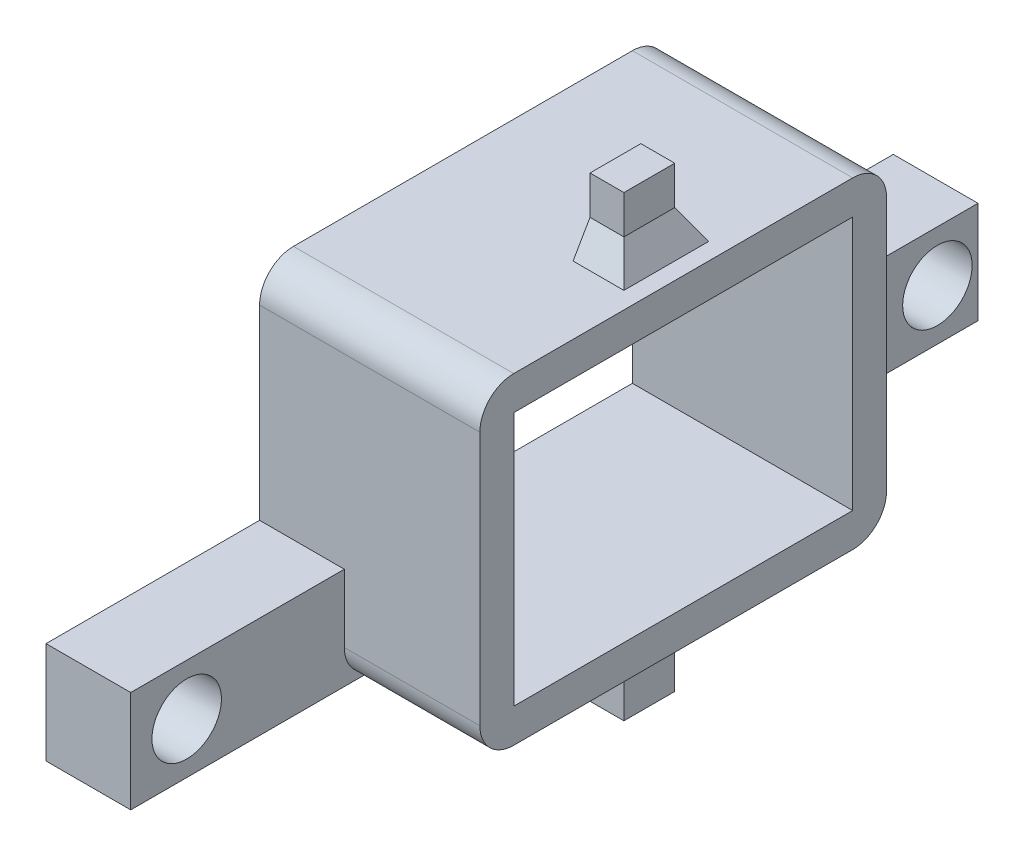
ISO-10303-21;
HEADER;
FILE_DESCRIPTION(('STEP AP214'),'2;1');
FILE_NAME('part.step','',(''),(''),'','','');
FILE_SCHEMA(('AUTOMOTIVE_DESIGN { 1 0 10303 214 1 1 1 1 }'));
ENDSEC;
DATA;
#1=APPLICATION_CONTEXT('core data for automotive mechanical design processes');
#2=APPLICATION_PROTOCOL_DEFINITION('international standard','automotive_design',2000,#1);
#3=PRODUCT_CONTEXT('',#1,'mechanical');
#4=PRODUCT('Part','Part','',(#3));
#5=PRODUCT_RELATED_PRODUCT_CATEGORY('part','',(#4));
#6=PRODUCT_DEFINITION_FORMATION('','',#4);
#7=PRODUCT_DEFINITION_CONTEXT('part definition',#1,'design');
#8=PRODUCT_DEFINITION('design','',#6,#7);
#9=PRODUCT_DEFINITION_SHAPE('','',#8);
#10=(LENGTH_UNIT() NAMED_UNIT(*) SI_UNIT(.MILLI.,.METRE.));
#11=(NAMED_UNIT(*) PLANE_ANGLE_UNIT() SI_UNIT($,.RADIAN.));
#12=(NAMED_UNIT(*) SI_UNIT($,.STERADIAN.) SOLID_ANGLE_UNIT());
#13=UNCERTAINTY_MEASURE_WITH_UNIT(LENGTH_MEASURE(1.E-05),#10,'distance_accuracy_value','');
#14=(GEOMETRIC_REPRESENTATION_CONTEXT(3) GLOBAL_UNCERTAINTY_ASSIGNED_CONTEXT((#13)) GLOBAL_UNIT_ASSIGNED_CONTEXT((#10,
#11,#12)) REPRESENTATION_CONTEXT('',''));
#15=CARTESIAN_POINT('',(0.,0.,0.));
#16=DIRECTION('',(0.,0.,1.));
#17=DIRECTION('',(1.,0.,0.));
#18=AXIS2_PLACEMENT_3D('',#15,#16,#17);
#19=CARTESIAN_POINT('',(13.,-17.,2.));
#20=DIRECTION('',(0.,1.,0.));
#21=DIRECTION('',(0.,0.,1.));
#22=AXIS2_PLACEMENT_3D('',#19,#20,#21);
#23=PLANE('',#22);
#24=DIRECTION('',(0.,0.,1.));
#25=VECTOR('',#24,1.);
#26=CARTESIAN_POINT('',(5.,-17.,-22.));
#27=LINE('',#26,#25);
#28=CARTESIAN_POINT('',(5.,-17.,-35.3962764589194));
#29=VERTEX_POINT('',#28);
#30=CARTESIAN_POINT('',(5.,-17.,-20.));
#31=VERTEX_POINT('',#30);
#32=EDGE_CURVE('E354',#29,#31,#27,.T.);
#33=ORIENTED_EDGE('',*,*,#32,.T.);
#34=DIRECTION('',(-1.,0.,0.));
#35=VECTOR('',#34,1.);
#36=CARTESIAN_POINT('',(13.,-17.,-20.));
#37=LINE('',#36,#35);
#38=CARTESIAN_POINT('',(13.,-17.,-20.));
#39=VERTEX_POINT('',#38);
#40=EDGE_CURVE('E451',#31,#39,#37,.F.);
#41=ORIENTED_EDGE('',*,*,#40,.T.);
#42=DIRECTION('',(0.,0.,-1.));
#43=VECTOR('',#42,1.);
#44=CARTESIAN_POINT('',(13.,-17.,2.));
#45=LINE('',#44,#43);
#46=CARTESIAN_POINT('',(13.,-17.,0.));
#47=VERTEX_POINT('',#46);
#48=EDGE_CURVE('E400',#47,#39,#45,.T.);
#49=ORIENTED_EDGE('',*,*,#48,.F.);
#50=DIRECTION('',(-1.,0.,0.));
#51=VECTOR('',#50,1.);
#52=CARTESIAN_POINT('',(13.,-17.,0.));
#53=LINE('',#52,#51);
#54=CARTESIAN_POINT('',(5.,-17.,0.));
#55=VERTEX_POINT('',#54);
#56=EDGE_CURVE('E448',#47,#55,#53,.T.);
#57=ORIENTED_EDGE('',*,*,#56,.T.);
#58=DIRECTION('',(0.,0.,1.));
#59=VECTOR('',#58,1.);
#60=CARTESIAN_POINT('',(5.,-17.,2.));
#61=LINE('',#60,#59);
#62=CARTESIAN_POINT('',(5.,-17.,14.6037235410806));
#63=VERTEX_POINT('',#62);
#64=EDGE_CURVE('E316',#55,#63,#61,.T.);
#65=ORIENTED_EDGE('',*,*,#64,.T.);
#66=DIRECTION('',(-1.,0.,0.));
#67=VECTOR('',#66,1.);
#68=CARTESIAN_POINT('',(5.,-17.,14.6037235410806));
#69=LINE('',#68,#67);
#70=CARTESIAN_POINT('',(0.,-17.,14.6037235410806));
#71=VERTEX_POINT('',#70);
#72=EDGE_CURVE('E326',#63,#71,#69,.T.);
#73=ORIENTED_EDGE('',*,*,#72,.T.);
#74=DIRECTION('',(0.,0.,-1.));
#75=VECTOR('',#74,1.);
#76=CARTESIAN_POINT('',(0.,-17.,2.));
#77=LINE('',#76,#75);
#78=CARTESIAN_POINT('',(0.,-17.,-35.3962764589194));
#79=VERTEX_POINT('',#78);
#80=EDGE_CURVE('E412',#71,#79,#77,.T.);
#81=ORIENTED_EDGE('',*,*,#80,.T.);
#82=DIRECTION('',(-1.,0.,0.));
#83=VECTOR('',#82,1.);
#84=CARTESIAN_POINT('',(5.,-17.,-35.3962764589194));
#85=LINE('',#84,#83);
#86=EDGE_CURVE('E361',#29,#79,#85,.T.);
#87=ORIENTED_EDGE('',*,*,#86,.F.);
#88=EDGE_LOOP('',(#33,#41,#49,#57,#65,#73,#81,#87));
#89=FACE_BOUND('',#88,.T.);
#90=DIRECTION('',(-1.,0.,0.));
#91=VECTOR('',#90,1.);
#92=CARTESIAN_POINT('',(9.,-17.,-12.5));
#93=LINE('',#92,#91);
#94=CARTESIAN_POINT('',(12.,-17.,-12.5));
#95=VERTEX_POINT('',#94);
#96=CARTESIAN_POINT('',(9.,-17.,-12.5));
#97=VERTEX_POINT('',#96);
#98=EDGE_CURVE('E485',#95,#97,#93,.T.);
#99=ORIENTED_EDGE('',*,*,#98,.T.);
#100=DIRECTION('',(0.,0.,-1.));
#101=VECTOR('',#100,1.);
#102=CARTESIAN_POINT('',(9.,-17.,-8.5));
#103=LINE('',#102,#101);
#104=CARTESIAN_POINT('',(9.,-17.,-7.50000000000001));
#105=VERTEX_POINT('',#104);
#106=EDGE_CURVE('E260',#105,#97,#103,.T.);
#107=ORIENTED_EDGE('',*,*,#106,.F.);
#108=DIRECTION('',(1.,0.,0.));
#109=VECTOR('',#108,1.);
#110=CARTESIAN_POINT('',(11.,-17.,-7.50000000000001));
#111=LINE('',#110,#109);
#112=CARTESIAN_POINT('',(12.,-17.,-7.50000000000001));
#113=VERTEX_POINT('',#112);
#114=EDGE_CURVE('E488',#105,#113,#111,.T.);
#115=ORIENTED_EDGE('',*,*,#114,.T.);
#116=DIRECTION('',(0.,0.,-1.));
#117=VECTOR('',#116,1.);
#118=CARTESIAN_POINT('',(12.,-17.,-11.5));
#119=LINE('',#118,#117);
#120=EDGE_CURVE('E483',#113,#95,#119,.T.);
#121=ORIENTED_EDGE('',*,*,#120,.T.);
#122=EDGE_LOOP('',(#99,#107,#115,#121));
#123=FACE_BOUND('',#122,.T.);
#124=ADVANCED_FACE('F35',(#89,#123),#23,.F.);
#125=CARTESIAN_POINT('',(13.,2.,2.));
#126=DIRECTION('',(0.,-1.,0.));
#127=DIRECTION('',(0.,0.,-1.));
#128=AXIS2_PLACEMENT_3D('',#125,#126,#127);
#129=PLANE('',#128);
#130=DIRECTION('',(0.,0.,1.));
#131=VECTOR('',#130,1.);
#132=CARTESIAN_POINT('',(13.,2.,2.));
#133=LINE('',#132,#131);
#134=CARTESIAN_POINT('',(13.,2.,-20.));
#135=VERTEX_POINT('',#134);
#136=CARTESIAN_POINT('',(13.,2.,0.));
#137=VERTEX_POINT('',#136);
#138=EDGE_CURVE('E407',#135,#137,#133,.T.);
#139=ORIENTED_EDGE('',*,*,#138,.F.);
#140=DIRECTION('',(-1.,0.,0.));
#141=VECTOR('',#140,1.);
#142=CARTESIAN_POINT('',(13.,2.,-20.));
#143=LINE('',#142,#141);
#144=CARTESIAN_POINT('',(0.,2.,-20.));
#145=VERTEX_POINT('',#144);
#146=EDGE_CURVE('E468',#135,#145,#143,.T.);
#147=ORIENTED_EDGE('',*,*,#146,.T.);
#148=DIRECTION('',(0.,0.,1.));
#149=VECTOR('',#148,1.);
#150=CARTESIAN_POINT('',(0.,2.,2.));
#151=LINE('',#150,#149);
#152=CARTESIAN_POINT('',(0.,2.,0.));
#153=VERTEX_POINT('',#152);
#154=EDGE_CURVE('E401',#145,#153,#151,.T.);
#155=ORIENTED_EDGE('',*,*,#154,.T.);
#156=DIRECTION('',(-1.,0.,0.));
#157=VECTOR('',#156,1.);
#158=CARTESIAN_POINT('',(13.,2.,0.));
#159=LINE('',#158,#157);
#160=EDGE_CURVE('E466',#153,#137,#159,.F.);
#161=ORIENTED_EDGE('',*,*,#160,.T.);
#162=EDGE_LOOP('',(#139,#147,#155,#161));
#163=FACE_BOUND('',#162,.T.);
#164=DIRECTION('',(-1.,0.,0.));
#165=VECTOR('',#164,1.);
#166=CARTESIAN_POINT('',(9.,2.,-7.50000000000001));
#167=LINE('',#166,#165);
#168=CARTESIAN_POINT('',(12.,2.,-7.50000000000001));
#169=VERTEX_POINT('',#168);
#170=CARTESIAN_POINT('',(9.,2.,-7.50000000000001));
#171=VERTEX_POINT('',#170);
#172=EDGE_CURVE('E423',#169,#171,#167,.T.);
#173=ORIENTED_EDGE('',*,*,#172,.T.);
#174=DIRECTION('',(0.,0.,1.));
#175=VECTOR('',#174,1.);
#176=CARTESIAN_POINT('',(9.,2.,-11.5));
#177=LINE('',#176,#175);
#178=CARTESIAN_POINT('',(9.,2.,-12.5));
#179=VERTEX_POINT('',#178);
#180=EDGE_CURVE('E263',#179,#171,#177,.T.);
#181=ORIENTED_EDGE('',*,*,#180,.F.);
#182=DIRECTION('',(1.,0.,0.));
#183=VECTOR('',#182,1.);
#184=CARTESIAN_POINT('',(11.,2.,-12.5));
#185=LINE('',#184,#183);
#186=CARTESIAN_POINT('',(12.,2.,-12.5));
#187=VERTEX_POINT('',#186);
#188=EDGE_CURVE('E426',#179,#187,#185,.T.);
#189=ORIENTED_EDGE('',*,*,#188,.T.);
#190=DIRECTION('',(0.,0.,1.));
#191=VECTOR('',#190,1.);
#192=CARTESIAN_POINT('',(12.,2.,-8.5));
#193=LINE('',#192,#191);
#194=EDGE_CURVE('E421',#187,#169,#193,.T.);
#195=ORIENTED_EDGE('',*,*,#194,.T.);
#196=EDGE_LOOP('',(#173,#181,#189,#195));
#197=FACE_BOUND('',#196,.T.);
#198=ADVANCED_FACE('F530',(#163,#197),#129,.F.);
#199=CARTESIAN_POINT('',(13.,0.,0.));
#200=DIRECTION('',(0.,0.,-1.));
#201=DIRECTION('',(0.,1.,0.));
#202=AXIS2_PLACEMENT_3D('',#199,#200,#201);
#203=PLANE('',#202);
#204=DIRECTION('',(-1.,0.,0.));
#205=VECTOR('',#204,1.);
#206=CARTESIAN_POINT('',(0.,-2.,0.));
#207=LINE('',#206,#205);
#208=CARTESIAN_POINT('',(3.,-2.,0.));
#209=VERTEX_POINT('',#208);
#210=CARTESIAN_POINT('',(0.,-2.,0.));
#211=VERTEX_POINT('',#210);
#212=EDGE_CURVE('E298',#209,#211,#207,.T.);
#213=ORIENTED_EDGE('',*,*,#212,.F.);
#214=DIRECTION('',(0.,1.,0.));
#215=VECTOR('',#214,1.);
#216=CARTESIAN_POINT('',(3.,-2.,0.));
#217=LINE('',#216,#215);
#218=CARTESIAN_POINT('',(3.,0.,0.));
#219=VERTEX_POINT('',#218);
#220=EDGE_CURVE('E300',#209,#219,#217,.T.);
#221=ORIENTED_EDGE('',*,*,#220,.T.);
#222=DIRECTION('',(-1.,0.,0.));
#223=VECTOR('',#222,1.);
#224=CARTESIAN_POINT('',(13.,0.,0.));
#225=LINE('',#224,#223);
#226=CARTESIAN_POINT('',(13.,0.,0.));
#227=VERTEX_POINT('',#226);
#228=EDGE_CURVE('E379',#227,#219,#225,.T.);
#229=ORIENTED_EDGE('',*,*,#228,.F.);
#230=DIRECTION('',(0.,-1.,0.));
#231=VECTOR('',#230,1.);
#232=CARTESIAN_POINT('',(13.,0.,0.));
#233=LINE('',#232,#231);
#234=CARTESIAN_POINT('',(13.,-15.,0.));
#235=VERTEX_POINT('',#234);
#236=EDGE_CURVE('E369',#227,#235,#233,.T.);
#237=ORIENTED_EDGE('',*,*,#236,.T.);
#238=DIRECTION('',(-1.,0.,0.));
#239=VECTOR('',#238,1.);
#240=CARTESIAN_POINT('',(13.,-15.,0.));
#241=LINE('',#240,#239);
#242=CARTESIAN_POINT('',(0.,-15.,0.));
#243=VERTEX_POINT('',#242);
#244=EDGE_CURVE('E393',#235,#243,#241,.T.);
#245=ORIENTED_EDGE('',*,*,#244,.T.);
#246=DIRECTION('',(0.,-1.,0.));
#247=VECTOR('',#246,1.);
#248=CARTESIAN_POINT('',(0.,0.,0.));
#249=LINE('',#248,#247);
#250=EDGE_CURVE('E364',#211,#243,#249,.T.);
#251=ORIENTED_EDGE('',*,*,#250,.F.);
#252=EDGE_LOOP('',(#213,#221,#229,#237,#245,#251));
#253=FACE_BOUND('',#252,.T.);
#254=ADVANCED_FACE('F536',(#253),#203,.T.);
#255=CARTESIAN_POINT('',(13.,0.,-20.));
#256=DIRECTION('',(0.,0.,1.));
#257=DIRECTION('',(0.,-1.,0.));
#258=AXIS2_PLACEMENT_3D('',#255,#256,#257);
#259=PLANE('',#258);
#260=DIRECTION('',(-1.,0.,0.));
#261=VECTOR('',#260,1.);
#262=CARTESIAN_POINT('',(13.,0.,-20.));
#263=LINE('',#262,#261);
#264=CARTESIAN_POINT('',(13.,0.,-20.));
#265=VERTEX_POINT('',#264);
#266=CARTESIAN_POINT('',(3.00000000000001,0.,-20.));
#267=VERTEX_POINT('',#266);
#268=EDGE_CURVE('E388',#265,#267,#263,.T.);
#269=ORIENTED_EDGE('',*,*,#268,.T.);
#270=DIRECTION('',(0.,1.,0.));
#271=VECTOR('',#270,1.);
#272=CARTESIAN_POINT('',(3.,-2.,-20.));
#273=LINE('',#272,#271);
#274=CARTESIAN_POINT('',(3.,-2.,-20.));
#275=VERTEX_POINT('',#274);
#276=EDGE_CURVE('E304',#275,#267,#273,.T.);
#277=ORIENTED_EDGE('',*,*,#276,.F.);
#278=DIRECTION('',(1.,0.,0.));
#279=VECTOR('',#278,1.);
#280=CARTESIAN_POINT('',(0.,-2.,-20.));
#281=LINE('',#280,#279);
#282=CARTESIAN_POINT('',(0.,-2.,-20.));
#283=VERTEX_POINT('',#282);
#284=EDGE_CURVE('E294',#283,#275,#281,.T.);
#285=ORIENTED_EDGE('',*,*,#284,.F.);
#286=DIRECTION('',(0.,1.,0.));
#287=VECTOR('',#286,1.);
#288=CARTESIAN_POINT('',(0.,0.,-20.));
#289=LINE('',#288,#287);
#290=CARTESIAN_POINT('',(0.,-15.,-20.));
#291=VERTEX_POINT('',#290);
#292=EDGE_CURVE('E372',#291,#283,#289,.T.);
#293=ORIENTED_EDGE('',*,*,#292,.F.);
#294=DIRECTION('',(-1.,0.,0.));
#295=VECTOR('',#294,1.);
#296=CARTESIAN_POINT('',(13.,-15.,-20.));
#297=LINE('',#296,#295);
#298=CARTESIAN_POINT('',(13.,-15.,-20.));
#299=VERTEX_POINT('',#298);
#300=EDGE_CURVE('E391',#299,#291,#297,.T.);
#301=ORIENTED_EDGE('',*,*,#300,.F.);
#302=DIRECTION('',(0.,1.,0.));
#303=VECTOR('',#302,1.);
#304=CARTESIAN_POINT('',(13.,0.,-20.));
#305=LINE('',#304,#303);
#306=EDGE_CURVE('E374',#299,#265,#305,.T.);
#307=ORIENTED_EDGE('',*,*,#306,.T.);
#308=EDGE_LOOP('',(#269,#277,#285,#293,#301,#307));
#309=FACE_BOUND('',#308,.T.);
#310=ADVANCED_FACE('F762',(#309),#259,.T.);
#311=CARTESIAN_POINT('',(13.,0.,0.));
#312=DIRECTION('',(0.,-1.,0.));
#313=DIRECTION('',(0.,0.,-1.));
#314=AXIS2_PLACEMENT_3D('',#311,#312,#313);
#315=PLANE('',#314);
#316=ORIENTED_EDGE('',*,*,#228,.T.);
#317=DIRECTION('',(0.,0.,1.));
#318=VECTOR('',#317,1.);
#319=CARTESIAN_POINT('',(3.,0.,0.));
#320=LINE('',#319,#318);
#321=EDGE_CURVE('E291',#267,#219,#320,.T.);
#322=ORIENTED_EDGE('',*,*,#321,.F.);
#323=ORIENTED_EDGE('',*,*,#268,.F.);
#324=DIRECTION('',(0.,0.,1.));
#325=VECTOR('',#324,1.);
#326=CARTESIAN_POINT('',(13.,0.,0.));
#327=LINE('',#326,#325);
#328=EDGE_CURVE('E377',#265,#227,#327,.T.);
#329=ORIENTED_EDGE('',*,*,#328,.T.);
#330=EDGE_LOOP('',(#316,#322,#323,#329));
#331=FACE_BOUND('',#330,.T.);
#332=ADVANCED_FACE('F546',(#331),#315,.T.);
#333=CARTESIAN_POINT('',(13.,2.,2.));
#334=DIRECTION('',(0.,0.,-1.));
#335=DIRECTION('',(0.,1.,0.));
#336=AXIS2_PLACEMENT_3D('',#333,#334,#335);
#337=PLANE('',#336);
#338=DIRECTION('',(0.,-1.,0.));
#339=VECTOR('',#338,1.);
#340=CARTESIAN_POINT('',(5.,-17.,2.));
#341=LINE('',#340,#339);
#342=CARTESIAN_POINT('',(5.,-11.,2.));
#343=VERTEX_POINT('',#342);
#344=CARTESIAN_POINT('',(5.,-15.,2.));
#345=VERTEX_POINT('',#344);
#346=EDGE_CURVE('E313',#343,#345,#341,.T.);
#347=ORIENTED_EDGE('',*,*,#346,.T.);
#348=DIRECTION('',(-1.,0.,0.));
#349=VECTOR('',#348,1.);
#350=CARTESIAN_POINT('',(13.,-15.,2.));
#351=LINE('',#350,#349);
#352=CARTESIAN_POINT('',(13.,-15.,2.));
#353=VERTEX_POINT('',#352);
#354=EDGE_CURVE('E464',#345,#353,#351,.F.);
#355=ORIENTED_EDGE('',*,*,#354,.T.);
#356=DIRECTION('',(0.,-1.,0.));
#357=VECTOR('',#356,1.);
#358=CARTESIAN_POINT('',(13.,2.,2.));
#359=LINE('',#358,#357);
#360=CARTESIAN_POINT('',(13.,0.,2.));
#361=VERTEX_POINT('',#360);
#362=EDGE_CURVE('E397',#361,#353,#359,.T.);
#363=ORIENTED_EDGE('',*,*,#362,.F.);
#364=DIRECTION('',(-1.,0.,0.));
#365=VECTOR('',#364,1.);
#366=CARTESIAN_POINT('',(13.,0.,2.));
#367=LINE('',#366,#365);
#368=CARTESIAN_POINT('',(0.,0.,2.));
#369=VERTEX_POINT('',#368);
#370=EDGE_CURVE('E461',#361,#369,#367,.T.);
#371=ORIENTED_EDGE('',*,*,#370,.T.);
#372=DIRECTION('',(0.,-1.,0.));
#373=VECTOR('',#372,1.);
#374=CARTESIAN_POINT('',(0.,2.,2.));
#375=LINE('',#374,#373);
#376=CARTESIAN_POINT('',(0.,-11.,2.));
#377=VERTEX_POINT('',#376);
#378=EDGE_CURVE('E396',#369,#377,#375,.T.);
#379=ORIENTED_EDGE('',*,*,#378,.T.);
#380=DIRECTION('',(-1.,0.,0.));
#381=VECTOR('',#380,1.);
#382=CARTESIAN_POINT('',(5.,-11.,2.));
#383=LINE('',#382,#381);
#384=EDGE_CURVE('E331',#343,#377,#383,.T.);
#385=ORIENTED_EDGE('',*,*,#384,.F.);
#386=EDGE_LOOP('',(#347,#355,#363,#371,#379,#385));
#387=FACE_BOUND('',#386,.T.);
#388=ADVANCED_FACE('F542',(#387),#337,.F.);
#389=CARTESIAN_POINT('',(13.,0.,0.));
#390=DIRECTION('',(1.,0.,0.));
#391=DIRECTION('',(0.,0.,-1.));
#392=AXIS2_PLACEMENT_3D('',#389,#390,#391);
#393=PLANE('',#392);
#394=ORIENTED_EDGE('',*,*,#48,.T.);
#395=CARTESIAN_POINT('',(13.,-15.,-20.));
#396=DIRECTION('',(1.,0.,0.));
#397=DIRECTION('',(0.,0.,-1.));
#398=AXIS2_PLACEMENT_3D('',#395,#396,#397);
#399=CIRCLE('',#398,2.);
#400=CARTESIAN_POINT('',(13.,-15.,-22.));
#401=VERTEX_POINT('',#400);
#402=EDGE_CURVE('E459',#39,#401,#399,.T.);
#403=ORIENTED_EDGE('',*,*,#402,.T.);
#404=DIRECTION('',(0.,1.,0.));
#405=VECTOR('',#404,1.);
#406=CARTESIAN_POINT('',(13.,2.,-22.));
#407=LINE('',#406,#405);
#408=CARTESIAN_POINT('',(13.,0.,-22.));
#409=VERTEX_POINT('',#408);
#410=EDGE_CURVE('E404',#401,#409,#407,.T.);
#411=ORIENTED_EDGE('',*,*,#410,.T.);
#412=CARTESIAN_POINT('',(13.,0.,-20.));
#413=DIRECTION('',(1.,0.,0.));
#414=DIRECTION('',(0.,0.,-1.));
#415=AXIS2_PLACEMENT_3D('',#412,#413,#414);
#416=CIRCLE('',#415,2.);
#417=EDGE_CURVE('E455',#409,#135,#416,.T.);
#418=ORIENTED_EDGE('',*,*,#417,.T.);
#419=ORIENTED_EDGE('',*,*,#138,.T.);
#420=CARTESIAN_POINT('',(13.,0.,0.));
#421=DIRECTION('',(1.,0.,0.));
#422=DIRECTION('',(0.,0.,-1.));
#423=AXIS2_PLACEMENT_3D('',#420,#421,#422);
#424=CIRCLE('',#423,2.);
#425=EDGE_CURVE('E453',#137,#361,#424,.T.);
#426=ORIENTED_EDGE('',*,*,#425,.T.);
#427=ORIENTED_EDGE('',*,*,#362,.T.);
#428=CARTESIAN_POINT('',(13.,-15.,0.));
#429=DIRECTION('',(1.,0.,0.));
#430=DIRECTION('',(0.,0.,-1.));
#431=AXIS2_PLACEMENT_3D('',#428,#429,#430);
#432=CIRCLE('',#431,2.);
#433=EDGE_CURVE('E457',#353,#47,#432,.T.);
#434=ORIENTED_EDGE('',*,*,#433,.T.);
#435=EDGE_LOOP('',(#394,#403,#411,#418,#419,#426,#427,#434));
#436=FACE_BOUND('',#435,.T.);
#437=DIRECTION('',(0.,0.,-1.));
#438=VECTOR('',#437,1.);
#439=CARTESIAN_POINT('',(13.,-15.,0.));
#440=LINE('',#439,#438);
#441=EDGE_CURVE('E371',#235,#299,#440,.T.);
#442=ORIENTED_EDGE('',*,*,#441,.F.);
#443=ORIENTED_EDGE('',*,*,#236,.F.);
#444=ORIENTED_EDGE('',*,*,#328,.F.);
#445=ORIENTED_EDGE('',*,*,#306,.F.);
#446=EDGE_LOOP('',(#442,#443,#444,#445));
#447=FACE_BOUND('',#446,.T.);
#448=ADVANCED_FACE('F545',(#436,#447),#393,.T.);
#449=CARTESIAN_POINT('',(0.,0.,0.));
#450=DIRECTION('',(1.,0.,0.));
#451=DIRECTION('',(0.,0.,-1.));
#452=AXIS2_PLACEMENT_3D('',#449,#450,#451);
#453=PLANE('',#452);
#454=DIRECTION('',(0.,0.,-1.));
#455=VECTOR('',#454,1.);
#456=CARTESIAN_POINT('',(0.,-2.,0.));
#457=LINE('',#456,#455);
#458=EDGE_CURVE('E292',#211,#283,#457,.T.);
#459=ORIENTED_EDGE('',*,*,#458,.F.);
#460=ORIENTED_EDGE('',*,*,#250,.T.);
#461=DIRECTION('',(0.,0.,-1.));
#462=VECTOR('',#461,1.);
#463=CARTESIAN_POINT('',(0.,-15.,0.));
#464=LINE('',#463,#462);
#465=EDGE_CURVE('E381',#243,#291,#464,.T.);
#466=ORIENTED_EDGE('',*,*,#465,.T.);
#467=ORIENTED_EDGE('',*,*,#292,.T.);
#468=EDGE_LOOP('',(#459,#460,#466,#467));
#469=FACE_BOUND('',#468,.T.);
#470=ORIENTED_EDGE('',*,*,#154,.F.);
#471=CARTESIAN_POINT('',(0.,0.,-20.));
#472=DIRECTION('',(1.,0.,0.));
#473=DIRECTION('',(0.,0.,-1.));
#474=AXIS2_PLACEMENT_3D('',#471,#472,#473);
#475=CIRCLE('',#474,2.);
#476=CARTESIAN_POINT('',(0.,0.,-22.));
#477=VERTEX_POINT('',#476);
#478=EDGE_CURVE('E473',#145,#477,#475,.F.);
#479=ORIENTED_EDGE('',*,*,#478,.T.);
#480=DIRECTION('',(0.,1.,0.));
#481=VECTOR('',#480,1.);
#482=CARTESIAN_POINT('',(0.,2.,-22.));
#483=LINE('',#482,#481);
#484=CARTESIAN_POINT('',(0.,-10.9964603513504,-22.));
#485=VERTEX_POINT('',#484);
#486=EDGE_CURVE('E414',#485,#477,#483,.T.);
#487=ORIENTED_EDGE('',*,*,#486,.F.);
#488=DIRECTION('',(0.,0.,-1.));
#489=VECTOR('',#488,1.);
#490=CARTESIAN_POINT('',(0.,-10.9964603513504,-22.));
#491=LINE('',#490,#489);
#492=CARTESIAN_POINT('',(0.,-10.9964603513504,-35.3962764589194));
#493=VERTEX_POINT('',#492);
#494=EDGE_CURVE('E342',#485,#493,#491,.T.);
#495=ORIENTED_EDGE('',*,*,#494,.T.);
#496=DIRECTION('',(0.,-1.,0.));
#497=VECTOR('',#496,1.);
#498=CARTESIAN_POINT('',(0.,-17.,-35.3962764589194));
#499=LINE('',#498,#497);
#500=EDGE_CURVE('E348',#493,#79,#499,.T.);
#501=ORIENTED_EDGE('',*,*,#500,.T.);
#502=ORIENTED_EDGE('',*,*,#80,.F.);
#503=DIRECTION('',(0.,1.,0.));
#504=VECTOR('',#503,1.);
#505=CARTESIAN_POINT('',(0.,-17.,14.6037235410806));
#506=LINE('',#505,#504);
#507=CARTESIAN_POINT('',(0.,-11.,14.6037235410806));
#508=VERTEX_POINT('',#507);
#509=EDGE_CURVE('E310',#71,#508,#506,.T.);
#510=ORIENTED_EDGE('',*,*,#509,.T.);
#511=DIRECTION('',(0.,0.,-1.));
#512=VECTOR('',#511,1.);
#513=CARTESIAN_POINT('',(0.,-11.,2.));
#514=LINE('',#513,#512);
#515=EDGE_CURVE('E317',#508,#377,#514,.T.);
#516=ORIENTED_EDGE('',*,*,#515,.T.);
#517=ORIENTED_EDGE('',*,*,#378,.F.);
#518=CARTESIAN_POINT('',(0.,0.,0.));
#519=DIRECTION('',(1.,0.,0.));
#520=DIRECTION('',(0.,0.,-1.));
#521=AXIS2_PLACEMENT_3D('',#518,#519,#520);
#522=CIRCLE('',#521,2.);
#523=EDGE_CURVE('E471',#369,#153,#522,.F.);
#524=ORIENTED_EDGE('',*,*,#523,.T.);
#525=EDGE_LOOP('',(#470,#479,#487,#495,#501,#502,#510,#516,#517,#524));
#526=FACE_BOUND('',#525,.T.);
#527=CARTESIAN_POINT('',(0.,-13.9982301756752,-33.));
#528=DIRECTION('',(-1.,0.,0.));
#529=DIRECTION('',(0.,0.,1.));
#530=AXIS2_PLACEMENT_3D('',#527,#528,#529);
#531=CIRCLE('',#530,2.05);
#532=CARTESIAN_POINT('',(0.,-13.9982301756752,-30.95));
#533=VERTEX_POINT('',#532);
#534=EDGE_CURVE('E334',#533,#533,#531,.T.);
#535=ORIENTED_EDGE('',*,*,#534,.F.);
#536=EDGE_LOOP('',(#535));
#537=FACE_BOUND('',#536,.T.);
#538=CARTESIAN_POINT('',(0.,-14.,11.299999964647));
#539=DIRECTION('',(-1.,0.,0.));
#540=DIRECTION('',(0.,0.,1.));
#541=AXIS2_PLACEMENT_3D('',#538,#539,#540);
#542=CIRCLE('',#541,2.05);
#543=CARTESIAN_POINT('',(0.,-14.,13.349999964647));
#544=VERTEX_POINT('',#543);
#545=EDGE_CURVE('E306',#544,#544,#542,.T.);
#546=ORIENTED_EDGE('',*,*,#545,.F.);
#547=EDGE_LOOP('',(#546));
#548=FACE_BOUND('',#547,.T.);
#549=ADVANCED_FACE('F741',(#469,#526,#537,#548),#453,.F.);
#550=CARTESIAN_POINT('',(13.,2.,-22.));
#551=DIRECTION('',(0.,0.,1.));
#552=DIRECTION('',(0.,-1.,0.));
#553=AXIS2_PLACEMENT_3D('',#550,#551,#552);
#554=PLANE('',#553);
#555=ORIENTED_EDGE('',*,*,#410,.F.);
#556=DIRECTION('',(-1.,0.,0.));
#557=VECTOR('',#556,1.);
#558=CARTESIAN_POINT('',(13.,-15.,-22.));
#559=LINE('',#558,#557);
#560=CARTESIAN_POINT('',(5.,-15.,-22.));
#561=VERTEX_POINT('',#560);
#562=EDGE_CURVE('E445',#401,#561,#559,.T.);
#563=ORIENTED_EDGE('',*,*,#562,.T.);
#564=DIRECTION('',(0.,1.,0.));
#565=VECTOR('',#564,1.);
#566=CARTESIAN_POINT('',(5.,-17.,-22.));
#567=LINE('',#566,#565);
#568=CARTESIAN_POINT('',(5.,-10.9964603513504,-22.));
#569=VERTEX_POINT('',#568);
#570=EDGE_CURVE('E345',#561,#569,#567,.T.);
#571=ORIENTED_EDGE('',*,*,#570,.T.);
#572=DIRECTION('',(-1.,0.,0.));
#573=VECTOR('',#572,1.);
#574=CARTESIAN_POINT('',(5.,-10.9964603513504,-22.));
#575=LINE('',#574,#573);
#576=EDGE_CURVE('E356',#569,#485,#575,.T.);
#577=ORIENTED_EDGE('',*,*,#576,.T.);
#578=ORIENTED_EDGE('',*,*,#486,.T.);
#579=DIRECTION('',(-1.,0.,0.));
#580=VECTOR('',#579,1.);
#581=CARTESIAN_POINT('',(13.,0.,-22.));
#582=LINE('',#581,#580);
#583=EDGE_CURVE('E437',#477,#409,#582,.F.);
#584=ORIENTED_EDGE('',*,*,#583,.T.);
#585=EDGE_LOOP('',(#555,#563,#571,#577,#578,#584));
#586=FACE_BOUND('',#585,.T.);
#587=ADVANCED_FACE('F541',(#586),#554,.F.);
#588=CARTESIAN_POINT('',(13.,-15.,0.));
#589=DIRECTION('',(0.,1.,0.));
#590=DIRECTION('',(0.,0.,1.));
#591=AXIS2_PLACEMENT_3D('',#588,#589,#590);
#592=PLANE('',#591);
#593=ORIENTED_EDGE('',*,*,#465,.F.);
#594=ORIENTED_EDGE('',*,*,#244,.F.);
#595=ORIENTED_EDGE('',*,*,#441,.T.);
#596=ORIENTED_EDGE('',*,*,#300,.T.);
#597=EDGE_LOOP('',(#593,#594,#595,#596));
#598=FACE_BOUND('',#597,.T.);
#599=ADVANCED_FACE('F846',(#598),#592,.T.);
#600=CARTESIAN_POINT('',(5.,-17.,-35.3962764589194));
#601=DIRECTION('',(0.,0.,-1.));
#602=DIRECTION('',(-1.,0.,0.));
#603=AXIS2_PLACEMENT_3D('',#600,#601,#602);
#604=PLANE('',#603);
#605=ORIENTED_EDGE('',*,*,#500,.F.);
#606=DIRECTION('',(-1.,0.,0.));
#607=VECTOR('',#606,1.);
#608=CARTESIAN_POINT('',(5.,-10.9964603513504,-35.3962764589194));
#609=LINE('',#608,#607);
#610=CARTESIAN_POINT('',(5.,-10.9964603513504,-35.3962764589194));
#611=VERTEX_POINT('',#610);
#612=EDGE_CURVE('E365',#611,#493,#609,.T.);
#613=ORIENTED_EDGE('',*,*,#612,.F.);
#614=DIRECTION('',(0.,-1.,0.));
#615=VECTOR('',#614,1.);
#616=CARTESIAN_POINT('',(5.,-17.,-35.3962764589194));
#617=LINE('',#616,#615);
#618=EDGE_CURVE('E351',#611,#29,#617,.T.);
#619=ORIENTED_EDGE('',*,*,#618,.T.);
#620=ORIENTED_EDGE('',*,*,#86,.T.);
#621=EDGE_LOOP('',(#605,#613,#619,#620));
#622=FACE_BOUND('',#621,.T.);
#623=ADVANCED_FACE('F838',(#622),#604,.T.);
#624=CARTESIAN_POINT('',(5.,-10.9964603513504,-22.));
#625=DIRECTION('',(0.,1.,0.));
#626=DIRECTION('',(0.,0.,1.));
#627=AXIS2_PLACEMENT_3D('',#624,#625,#626);
#628=PLANE('',#627);
#629=ORIENTED_EDGE('',*,*,#494,.F.);
#630=ORIENTED_EDGE('',*,*,#576,.F.);
#631=DIRECTION('',(0.,0.,-1.));
#632=VECTOR('',#631,1.);
#633=CARTESIAN_POINT('',(5.,-10.9964603513504,-22.));
#634=LINE('',#633,#632);
#635=EDGE_CURVE('E347',#569,#611,#634,.T.);
#636=ORIENTED_EDGE('',*,*,#635,.T.);
#637=ORIENTED_EDGE('',*,*,#612,.T.);
#638=EDGE_LOOP('',(#629,#630,#636,#637));
#639=FACE_BOUND('',#638,.T.);
#640=ADVANCED_FACE('F831',(#639),#628,.T.);
#641=CARTESIAN_POINT('',(5.,0.,0.));
#642=DIRECTION('',(-1.,0.,0.));
#643=DIRECTION('',(0.,0.,1.));
#644=AXIS2_PLACEMENT_3D('',#641,#642,#643);
#645=PLANE('',#644);
#646=CARTESIAN_POINT('',(5.,-13.9982301756752,-33.));
#647=DIRECTION('',(-1.,0.,0.));
#648=DIRECTION('',(0.,0.,1.));
#649=AXIS2_PLACEMENT_3D('',#646,#647,#648);
#650=CIRCLE('',#649,2.05);
#651=CARTESIAN_POINT('',(5.,-13.9982301756752,-30.95));
#652=VERTEX_POINT('',#651);
#653=EDGE_CURVE('E339',#652,#652,#650,.T.);
#654=ORIENTED_EDGE('',*,*,#653,.T.);
#655=EDGE_LOOP('',(#654));
#656=FACE_BOUND('',#655,.T.);
#657=ORIENTED_EDGE('',*,*,#570,.F.);
#658=CARTESIAN_POINT('',(5.,-15.,-20.));
#659=DIRECTION('',(-1.,0.,0.));
#660=DIRECTION('',(0.,0.,1.));
#661=AXIS2_PLACEMENT_3D('',#658,#659,#660);
#662=CIRCLE('',#661,2.);
#663=EDGE_CURVE('E475',#561,#31,#662,.T.);
#664=ORIENTED_EDGE('',*,*,#663,.T.);
#665=ORIENTED_EDGE('',*,*,#32,.F.);
#666=ORIENTED_EDGE('',*,*,#618,.F.);
#667=ORIENTED_EDGE('',*,*,#635,.F.);
#668=EDGE_LOOP('',(#657,#664,#665,#666,#667));
#669=FACE_BOUND('',#668,.T.);
#670=ADVANCED_FACE('F822',(#656,#669),#645,.F.);
#671=CARTESIAN_POINT('',(5.,-13.9982301756752,-33.));
#672=DIRECTION('',(-1.,0.,0.));
#673=DIRECTION('',(0.,0.,1.));
#674=AXIS2_PLACEMENT_3D('',#671,#672,#673);
#675=CYLINDRICAL_SURFACE('',#674,2.05);
#676=ORIENTED_EDGE('',*,*,#653,.F.);
#677=EDGE_LOOP('',(#676));
#678=FACE_BOUND('',#677,.T.);
#679=ORIENTED_EDGE('',*,*,#534,.T.);
#680=EDGE_LOOP('',(#679));
#681=FACE_BOUND('',#680,.T.);
#682=ADVANCED_FACE('F813',(#678,#681),#675,.F.);
#683=CARTESIAN_POINT('',(5.,-11.,2.));
#684=DIRECTION('',(0.,1.,0.));
#685=DIRECTION('',(0.,0.,1.));
#686=AXIS2_PLACEMENT_3D('',#683,#684,#685);
#687=PLANE('',#686);
#688=ORIENTED_EDGE('',*,*,#515,.F.);
#689=DIRECTION('',(-1.,0.,0.));
#690=VECTOR('',#689,1.);
#691=CARTESIAN_POINT('',(5.,-11.,14.6037235410806));
#692=LINE('',#691,#690);
#693=CARTESIAN_POINT('',(5.,-11.,14.6037235410806));
#694=VERTEX_POINT('',#693);
#695=EDGE_CURVE('E335',#694,#508,#692,.T.);
#696=ORIENTED_EDGE('',*,*,#695,.F.);
#697=DIRECTION('',(0.,0.,-1.));
#698=VECTOR('',#697,1.);
#699=CARTESIAN_POINT('',(5.,-11.,2.));
#700=LINE('',#699,#698);
#701=EDGE_CURVE('E323',#694,#343,#700,.T.);
#702=ORIENTED_EDGE('',*,*,#701,.T.);
#703=ORIENTED_EDGE('',*,*,#384,.T.);
#704=EDGE_LOOP('',(#688,#696,#702,#703));
#705=FACE_BOUND('',#704,.T.);
#706=ADVANCED_FACE('F804',(#705),#687,.T.);
#707=CARTESIAN_POINT('',(5.,-17.,14.6037235410806));
#708=DIRECTION('',(0.,0.,1.));
#709=DIRECTION('',(1.,0.,0.));
#710=AXIS2_PLACEMENT_3D('',#707,#708,#709);
#711=PLANE('',#710);
#712=ORIENTED_EDGE('',*,*,#509,.F.);
#713=ORIENTED_EDGE('',*,*,#72,.F.);
#714=DIRECTION('',(0.,1.,0.));
#715=VECTOR('',#714,1.);
#716=CARTESIAN_POINT('',(5.,-17.,14.6037235410806));
#717=LINE('',#716,#715);
#718=EDGE_CURVE('E320',#63,#694,#717,.T.);
#719=ORIENTED_EDGE('',*,*,#718,.T.);
#720=ORIENTED_EDGE('',*,*,#695,.T.);
#721=EDGE_LOOP('',(#712,#713,#719,#720));
#722=FACE_BOUND('',#721,.T.);
#723=ADVANCED_FACE('F795',(#722),#711,.T.);
#724=CARTESIAN_POINT('',(5.,0.,0.));
#725=DIRECTION('',(1.,0.,0.));
#726=DIRECTION('',(0.,0.,-1.));
#727=AXIS2_PLACEMENT_3D('',#724,#725,#726);
#728=PLANE('',#727);
#729=CARTESIAN_POINT('',(5.,-14.,11.299999964647));
#730=DIRECTION('',(-1.,0.,0.));
#731=DIRECTION('',(0.,0.,1.));
#732=AXIS2_PLACEMENT_3D('',#729,#730,#731);
#733=CIRCLE('',#732,2.05);
#734=CARTESIAN_POINT('',(5.,-14.,13.349999964647));
#735=VERTEX_POINT('',#734);
#736=EDGE_CURVE('E307',#735,#735,#733,.T.);
#737=ORIENTED_EDGE('',*,*,#736,.T.);
#738=EDGE_LOOP('',(#737));
#739=FACE_BOUND('',#738,.T.);
#740=ORIENTED_EDGE('',*,*,#346,.F.);
#741=ORIENTED_EDGE('',*,*,#701,.F.);
#742=ORIENTED_EDGE('',*,*,#718,.F.);
#743=ORIENTED_EDGE('',*,*,#64,.F.);
#744=CARTESIAN_POINT('',(5.,-15.,0.));
#745=DIRECTION('',(1.,0.,0.));
#746=DIRECTION('',(0.,0.,-1.));
#747=AXIS2_PLACEMENT_3D('',#744,#745,#746);
#748=CIRCLE('',#747,2.);
#749=EDGE_CURVE('E478',#55,#345,#748,.F.);
#750=ORIENTED_EDGE('',*,*,#749,.T.);
#751=EDGE_LOOP('',(#740,#741,#742,#743,#750));
#752=FACE_BOUND('',#751,.T.);
#753=ADVANCED_FACE('F786',(#739,#752),#728,.T.);
#754=CARTESIAN_POINT('',(5.,-14.,11.299999964647));
#755=DIRECTION('',(-1.,0.,0.));
#756=DIRECTION('',(0.,0.,1.));
#757=AXIS2_PLACEMENT_3D('',#754,#755,#756);
#758=CYLINDRICAL_SURFACE('',#757,2.05);
#759=ORIENTED_EDGE('',*,*,#736,.F.);
#760=EDGE_LOOP('',(#759));
#761=FACE_BOUND('',#760,.T.);
#762=ORIENTED_EDGE('',*,*,#545,.T.);
#763=EDGE_LOOP('',(#762));
#764=FACE_BOUND('',#763,.T.);
#765=ADVANCED_FACE('F736',(#761,#764),#758,.F.);
#766=CARTESIAN_POINT('',(3.,-2.,0.));
#767=DIRECTION('',(-1.,0.,0.));
#768=DIRECTION('',(0.,0.,1.));
#769=AXIS2_PLACEMENT_3D('',#766,#767,#768);
#770=PLANE('',#769);
#771=ORIENTED_EDGE('',*,*,#321,.T.);
#772=ORIENTED_EDGE('',*,*,#220,.F.);
#773=DIRECTION('',(0.,0.,1.));
#774=VECTOR('',#773,1.);
#775=CARTESIAN_POINT('',(3.,-2.,0.));
#776=LINE('',#775,#774);
#777=EDGE_CURVE('E296',#275,#209,#776,.T.);
#778=ORIENTED_EDGE('',*,*,#777,.F.);
#779=ORIENTED_EDGE('',*,*,#276,.T.);
#780=EDGE_LOOP('',(#771,#772,#778,#779));
#781=FACE_BOUND('',#780,.T.);
#782=ADVANCED_FACE('F727',(#781),#770,.F.);
#783=CARTESIAN_POINT('',(0.,-2.,0.));
#784=DIRECTION('',(0.,-1.,0.));
#785=DIRECTION('',(0.,0.,-1.));
#786=AXIS2_PLACEMENT_3D('',#783,#784,#785);
#787=PLANE('',#786);
#788=ORIENTED_EDGE('',*,*,#458,.T.);
#789=ORIENTED_EDGE('',*,*,#284,.T.);
#790=ORIENTED_EDGE('',*,*,#777,.T.);
#791=ORIENTED_EDGE('',*,*,#212,.T.);
#792=EDGE_LOOP('',(#788,#789,#790,#791));
#793=FACE_BOUND('',#792,.T.);
#794=ADVANCED_FACE('F714',(#793),#787,.T.);
#795=CARTESIAN_POINT('',(9.,6.,-11.5));
#796=DIRECTION('',(1.,0.,0.));
#797=DIRECTION('',(0.,0.,-1.));
#798=AXIS2_PLACEMENT_3D('',#795,#796,#797);
#799=PLANE('',#798);
#800=ORIENTED_EDGE('',*,*,#180,.T.);
#801=DIRECTION('',(0.,-0.866025403784441,0.499999999999996));
#802=VECTOR('',#801,1.);
#803=CARTESIAN_POINT('',(9.,6.73205080756888,-10.2320508075689));
#804=LINE('',#803,#802);
#805=CARTESIAN_POINT('',(9.,3.73205080756889,-8.5));
#806=VERTEX_POINT('',#805);
#807=EDGE_CURVE('E435',#171,#806,#804,.F.);
#808=ORIENTED_EDGE('',*,*,#807,.T.);
#809=DIRECTION('',(0.,-1.,0.));
#810=VECTOR('',#809,1.);
#811=CARTESIAN_POINT('',(9.,6.,-8.5));
#812=LINE('',#811,#810);
#813=CARTESIAN_POINT('',(9.,6.,-8.5));
#814=VERTEX_POINT('',#813);
#815=EDGE_CURVE('E288',#814,#806,#812,.T.);
#816=ORIENTED_EDGE('',*,*,#815,.F.);
#817=DIRECTION('',(0.,0.,1.));
#818=VECTOR('',#817,1.);
#819=CARTESIAN_POINT('',(9.,6.,-11.5));
#820=LINE('',#819,#818);
#821=CARTESIAN_POINT('',(9.,6.,-11.5));
#822=VERTEX_POINT('',#821);
#823=EDGE_CURVE('E265',#822,#814,#820,.T.);
#824=ORIENTED_EDGE('',*,*,#823,.F.);
#825=DIRECTION('',(0.,-1.,0.));
#826=VECTOR('',#825,1.);
#827=CARTESIAN_POINT('',(9.,6.,-11.5));
#828=LINE('',#827,#826);
#829=CARTESIAN_POINT('',(9.,3.73205080756889,-11.5));
#830=VERTEX_POINT('',#829);
#831=EDGE_CURVE('E278',#822,#830,#828,.T.);
#832=ORIENTED_EDGE('',*,*,#831,.T.);
#833=DIRECTION('',(0.,0.866025403784441,0.499999999999996));
#834=VECTOR('',#833,1.);
#835=CARTESIAN_POINT('',(9.,5.43301270189223,-10.5179491924311));
#836=LINE('',#835,#834);
#837=EDGE_CURVE('E432',#830,#179,#836,.F.);
#838=ORIENTED_EDGE('',*,*,#837,.T.);
#839=EDGE_LOOP('',(#800,#808,#816,#824,#832,#838));
#840=FACE_BOUND('',#839,.T.);
#841=ADVANCED_FACE('F706',(#840),#799,.F.);
#842=CARTESIAN_POINT('',(9.,6.,-8.5));
#843=DIRECTION('',(0.,0.,-1.));
#844=DIRECTION('',(-1.,0.,0.));
#845=AXIS2_PLACEMENT_3D('',#842,#843,#844);
#846=PLANE('',#845);
#847=ORIENTED_EDGE('',*,*,#815,.T.);
#848=DIRECTION('',(1.,0.,0.));
#849=VECTOR('',#848,1.);
#850=CARTESIAN_POINT('',(11.,3.73205080756889,-8.5));
#851=LINE('',#850,#849);
#852=CARTESIAN_POINT('',(11.,3.73205080756889,-8.5));
#853=VERTEX_POINT('',#852);
#854=EDGE_CURVE('E428',#806,#853,#851,.T.);
#855=ORIENTED_EDGE('',*,*,#854,.T.);
#856=DIRECTION('',(0.,-1.,0.));
#857=VECTOR('',#856,1.);
#858=CARTESIAN_POINT('',(11.,6.,-8.5));
#859=LINE('',#858,#857);
#860=CARTESIAN_POINT('',(11.,6.,-8.5));
#861=VERTEX_POINT('',#860);
#862=EDGE_CURVE('E285',#861,#853,#859,.T.);
#863=ORIENTED_EDGE('',*,*,#862,.F.);
#864=DIRECTION('',(1.,0.,0.));
#865=VECTOR('',#864,1.);
#866=CARTESIAN_POINT('',(9.,6.,-8.5));
#867=LINE('',#866,#865);
#868=EDGE_CURVE('E273',#814,#861,#867,.T.);
#869=ORIENTED_EDGE('',*,*,#868,.F.);
#870=EDGE_LOOP('',(#847,#855,#863,#869));
#871=FACE_BOUND('',#870,.T.);
#872=ADVANCED_FACE('F697',(#871),#846,.F.);
#873=CARTESIAN_POINT('',(11.,6.,-11.5));
#874=DIRECTION('',(-1.,0.,0.));
#875=DIRECTION('',(0.,0.,1.));
#876=AXIS2_PLACEMENT_3D('',#873,#874,#875);
#877=PLANE('',#876);
#878=ORIENTED_EDGE('',*,*,#862,.T.);
#879=DIRECTION('',(0.,0.,-1.));
#880=VECTOR('',#879,1.);
#881=CARTESIAN_POINT('',(11.,3.73205080756889,-11.5));
#882=LINE('',#881,#880);
#883=CARTESIAN_POINT('',(11.,3.73205080756889,-11.5));
#884=VERTEX_POINT('',#883);
#885=EDGE_CURVE('E430',#853,#884,#882,.T.);
#886=ORIENTED_EDGE('',*,*,#885,.T.);
#887=DIRECTION('',(0.,-1.,0.));
#888=VECTOR('',#887,1.);
#889=CARTESIAN_POINT('',(11.,6.,-11.5));
#890=LINE('',#889,#888);
#891=CARTESIAN_POINT('',(11.,6.,-11.5));
#892=VERTEX_POINT('',#891);
#893=EDGE_CURVE('E282',#892,#884,#890,.T.);
#894=ORIENTED_EDGE('',*,*,#893,.F.);
#895=DIRECTION('',(0.,0.,-1.));
#896=VECTOR('',#895,1.);
#897=CARTESIAN_POINT('',(11.,6.,-11.5));
#898=LINE('',#897,#896);
#899=EDGE_CURVE('E275',#861,#892,#898,.T.);
#900=ORIENTED_EDGE('',*,*,#899,.F.);
#901=EDGE_LOOP('',(#878,#886,#894,#900));
#902=FACE_BOUND('',#901,.T.);
#903=ADVANCED_FACE('F688',(#902),#877,.F.);
#904=CARTESIAN_POINT('',(9.,6.,-11.5));
#905=DIRECTION('',(0.,0.,1.));
#906=DIRECTION('',(1.,0.,0.));
#907=AXIS2_PLACEMENT_3D('',#904,#905,#906);
#908=PLANE('',#907);
#909=ORIENTED_EDGE('',*,*,#893,.T.);
#910=DIRECTION('',(-1.,0.,0.));
#911=VECTOR('',#910,1.);
#912=CARTESIAN_POINT('',(9.,3.73205080756889,-11.5));
#913=LINE('',#912,#911);
#914=EDGE_CURVE('E410',#884,#830,#913,.T.);
#915=ORIENTED_EDGE('',*,*,#914,.T.);
#916=ORIENTED_EDGE('',*,*,#831,.F.);
#917=DIRECTION('',(-1.,0.,0.));
#918=VECTOR('',#917,1.);
#919=CARTESIAN_POINT('',(9.,6.,-11.5));
#920=LINE('',#919,#918);
#921=EDGE_CURVE('E277',#892,#822,#920,.T.);
#922=ORIENTED_EDGE('',*,*,#921,.F.);
#923=EDGE_LOOP('',(#909,#915,#916,#922));
#924=FACE_BOUND('',#923,.T.);
#925=ADVANCED_FACE('F679',(#924),#908,.F.);
#926=CARTESIAN_POINT('',(0.,6.,0.));
#927=DIRECTION('',(0.,1.,0.));
#928=DIRECTION('',(0.,0.,1.));
#929=AXIS2_PLACEMENT_3D('',#926,#927,#928);
#930=PLANE('',#929);
#931=ORIENTED_EDGE('',*,*,#823,.T.);
#932=ORIENTED_EDGE('',*,*,#868,.T.);
#933=ORIENTED_EDGE('',*,*,#899,.T.);
#934=ORIENTED_EDGE('',*,*,#921,.T.);
#935=EDGE_LOOP('',(#931,#932,#933,#934));
#936=FACE_BOUND('',#935,.T.);
#937=ADVANCED_FACE('F659',(#936),#930,.T.);
#938=CARTESIAN_POINT('',(9.,-21.,-8.5));
#939=DIRECTION('',(1.,0.,0.));
#940=DIRECTION('',(0.,0.,-1.));
#941=AXIS2_PLACEMENT_3D('',#938,#939,#940);
#942=PLANE('',#941);
#943=ORIENTED_EDGE('',*,*,#106,.T.);
#944=DIRECTION('',(0.,0.866025403784441,-0.499999999999996));
#945=VECTOR('',#944,1.);
#946=CARTESIAN_POINT('',(9.,-21.7320508075689,-9.76794919243114));
#947=LINE('',#946,#945);
#948=CARTESIAN_POINT('',(9.,-18.7320508075689,-11.5));
#949=VERTEX_POINT('',#948);
#950=EDGE_CURVE('E11',#97,#949,#947,.F.);
#951=ORIENTED_EDGE('',*,*,#950,.T.);
#952=DIRECTION('',(0.,1.,0.));
#953=VECTOR('',#952,1.);
#954=CARTESIAN_POINT('',(9.,-21.,-11.5));
#955=LINE('',#954,#953);
#956=CARTESIAN_POINT('',(9.,-21.,-11.5));
#957=VERTEX_POINT('',#956);
#958=EDGE_CURVE('E247',#957,#949,#955,.T.);
#959=ORIENTED_EDGE('',*,*,#958,.F.);
#960=DIRECTION('',(0.,0.,-1.));
#961=VECTOR('',#960,1.);
#962=CARTESIAN_POINT('',(9.,-21.,-8.5));
#963=LINE('',#962,#961);
#964=CARTESIAN_POINT('',(9.,-21.,-8.5));
#965=VERTEX_POINT('',#964);
#966=EDGE_CURVE('E252',#965,#957,#963,.T.);
#967=ORIENTED_EDGE('',*,*,#966,.F.);
#968=DIRECTION('',(0.,1.,0.));
#969=VECTOR('',#968,1.);
#970=CARTESIAN_POINT('',(9.,-21.,-8.5));
#971=LINE('',#970,#969);
#972=CARTESIAN_POINT('',(9.,-18.7320508075689,-8.5));
#973=VERTEX_POINT('',#972);
#974=EDGE_CURVE('E513',#965,#973,#971,.T.);
#975=ORIENTED_EDGE('',*,*,#974,.T.);
#976=DIRECTION('',(0.,-0.866025403784441,-0.499999999999996));
#977=VECTOR('',#976,1.);
#978=CARTESIAN_POINT('',(9.,-20.4330127018922,-9.48205080756887));
#979=LINE('',#978,#977);
#980=EDGE_CURVE('E45',#973,#105,#979,.F.);
#981=ORIENTED_EDGE('',*,*,#980,.T.);
#982=EDGE_LOOP('',(#943,#951,#959,#967,#975,#981));
#983=FACE_BOUND('',#982,.T.);
#984=ADVANCED_FACE('F262',(#983),#942,.F.);
#985=CARTESIAN_POINT('',(9.,-21.,-11.5));
#986=DIRECTION('',(0.,0.,1.));
#987=DIRECTION('',(1.,0.,0.));
#988=AXIS2_PLACEMENT_3D('',#985,#986,#987);
#989=PLANE('',#988);
#990=ORIENTED_EDGE('',*,*,#958,.T.);
#991=DIRECTION('',(1.,0.,0.));
#992=VECTOR('',#991,1.);
#993=CARTESIAN_POINT('',(11.,-18.7320508075689,-11.5));
#994=LINE('',#993,#992);
#995=CARTESIAN_POINT('',(11.,-18.7320508075689,-11.5));
#996=VERTEX_POINT('',#995);
#997=EDGE_CURVE('E58',#949,#996,#994,.T.);
#998=ORIENTED_EDGE('',*,*,#997,.T.);
#999=DIRECTION('',(0.,1.,0.));
#1000=VECTOR('',#999,1.);
#1001=CARTESIAN_POINT('',(11.,-21.,-11.5));
#1002=LINE('',#1001,#1000);
#1003=CARTESIAN_POINT('',(11.,-21.,-11.5));
#1004=VERTEX_POINT('',#1003);
#1005=EDGE_CURVE('E248',#1004,#996,#1002,.T.);
#1006=ORIENTED_EDGE('',*,*,#1005,.F.);
#1007=DIRECTION('',(1.,0.,0.));
#1008=VECTOR('',#1007,1.);
#1009=CARTESIAN_POINT('',(9.,-21.,-11.5));
#1010=LINE('',#1009,#1008);
#1011=EDGE_CURVE('E244',#957,#1004,#1010,.T.);
#1012=ORIENTED_EDGE('',*,*,#1011,.F.);
#1013=EDGE_LOOP('',(#990,#998,#1006,#1012));
#1014=FACE_BOUND('',#1013,.T.);
#1015=ADVANCED_FACE('F246',(#1014),#989,.F.);
#1016=CARTESIAN_POINT('',(11.,-21.,-8.5));
#1017=DIRECTION('',(-1.,0.,0.));
#1018=DIRECTION('',(0.,0.,1.));
#1019=AXIS2_PLACEMENT_3D('',#1016,#1017,#1018);
#1020=PLANE('',#1019);
#1021=ORIENTED_EDGE('',*,*,#1005,.T.);
#1022=DIRECTION('',(0.,0.,1.));
#1023=VECTOR('',#1022,1.);
#1024=CARTESIAN_POINT('',(11.,-18.7320508075689,-8.5));
#1025=LINE('',#1024,#1023);
#1026=CARTESIAN_POINT('',(11.,-18.7320508075689,-8.5));
#1027=VERTEX_POINT('',#1026);
#1028=EDGE_CURVE('E491',#996,#1027,#1025,.T.);
#1029=ORIENTED_EDGE('',*,*,#1028,.T.);
#1030=DIRECTION('',(0.,1.,0.));
#1031=VECTOR('',#1030,1.);
#1032=CARTESIAN_POINT('',(11.,-21.,-8.5));
#1033=LINE('',#1032,#1031);
#1034=CARTESIAN_POINT('',(11.,-21.,-8.5));
#1035=VERTEX_POINT('',#1034);
#1036=EDGE_CURVE('E267',#1035,#1027,#1033,.T.);
#1037=ORIENTED_EDGE('',*,*,#1036,.F.);
#1038=DIRECTION('',(0.,0.,1.));
#1039=VECTOR('',#1038,1.);
#1040=CARTESIAN_POINT('',(11.,-21.,-8.5));
#1041=LINE('',#1040,#1039);
#1042=EDGE_CURVE('E251',#1004,#1035,#1041,.T.);
#1043=ORIENTED_EDGE('',*,*,#1042,.F.);
#1044=EDGE_LOOP('',(#1021,#1029,#1037,#1043));
#1045=FACE_BOUND('',#1044,.T.);
#1046=ADVANCED_FACE('F520',(#1045),#1020,.F.);
#1047=CARTESIAN_POINT('',(9.,-21.,-8.5));
#1048=DIRECTION('',(0.,0.,-1.));
#1049=DIRECTION('',(-1.,0.,0.));
#1050=AXIS2_PLACEMENT_3D('',#1047,#1048,#1049);
#1051=PLANE('',#1050);
#1052=ORIENTED_EDGE('',*,*,#1036,.T.);
#1053=DIRECTION('',(-1.,0.,0.));
#1054=VECTOR('',#1053,1.);
#1055=CARTESIAN_POINT('',(9.,-18.7320508075689,-8.5));
#1056=LINE('',#1055,#1054);
#1057=EDGE_CURVE('E480',#1027,#973,#1056,.T.);
#1058=ORIENTED_EDGE('',*,*,#1057,.T.);
#1059=ORIENTED_EDGE('',*,*,#974,.F.);
#1060=DIRECTION('',(-1.,0.,0.));
#1061=VECTOR('',#1060,1.);
#1062=CARTESIAN_POINT('',(9.,-21.,-8.5));
#1063=LINE('',#1062,#1061);
#1064=EDGE_CURVE('E257',#1035,#965,#1063,.T.);
#1065=ORIENTED_EDGE('',*,*,#1064,.F.);
#1066=EDGE_LOOP('',(#1052,#1058,#1059,#1065));
#1067=FACE_BOUND('',#1066,.T.);
#1068=ADVANCED_FACE('F512',(#1067),#1051,.F.);
#1069=CARTESIAN_POINT('',(0.,-21.,0.));
#1070=DIRECTION('',(0.,-1.,0.));
#1071=DIRECTION('',(0.,0.,-1.));
#1072=AXIS2_PLACEMENT_3D('',#1069,#1070,#1071);
#1073=PLANE('',#1072);
#1074=ORIENTED_EDGE('',*,*,#966,.T.);
#1075=ORIENTED_EDGE('',*,*,#1011,.T.);
#1076=ORIENTED_EDGE('',*,*,#1042,.T.);
#1077=ORIENTED_EDGE('',*,*,#1064,.T.);
#1078=EDGE_LOOP('',(#1074,#1075,#1076,#1077));
#1079=FACE_BOUND('',#1078,.T.);
#1080=ADVANCED_FACE('F255',(#1079),#1073,.T.);
#1081=CARTESIAN_POINT('',(9.,3.73205080756889,-8.5));
#1082=DIRECTION('',(0.,0.499999999999996,0.866025403784441));
#1083=DIRECTION('',(-1.,0.,0.));
#1084=AXIS2_PLACEMENT_3D('',#1081,#1082,#1083);
#1085=PLANE('',#1084);
#1086=ORIENTED_EDGE('',*,*,#807,.F.);
#1087=ORIENTED_EDGE('',*,*,#172,.F.);
#1088=DIRECTION('',(0.447213595499955,-0.774596669241487,0.447213595499955));
#1089=VECTOR('',#1088,1.);
#1090=CARTESIAN_POINT('',(10.4,4.77128129211021,-9.09999999999999));
#1091=LINE('',#1090,#1089);
#1092=EDGE_CURVE('E441',#853,#169,#1091,.T.);
#1093=ORIENTED_EDGE('',*,*,#1092,.F.);
#1094=ORIENTED_EDGE('',*,*,#854,.F.);
#1095=EDGE_LOOP('',(#1086,#1087,#1093,#1094));
#1096=FACE_BOUND('',#1095,.T.);
#1097=ADVANCED_FACE('F563',(#1096),#1085,.T.);
#1098=CARTESIAN_POINT('',(11.,3.73205080756889,-11.5));
#1099=DIRECTION('',(0.866025403784441,0.499999999999996,0.));
#1100=DIRECTION('',(0.,0.,1.));
#1101=AXIS2_PLACEMENT_3D('',#1098,#1099,#1100);
#1102=PLANE('',#1101);
#1103=ORIENTED_EDGE('',*,*,#1092,.T.);
#1104=ORIENTED_EDGE('',*,*,#194,.F.);
#1105=DIRECTION('',(-0.447213595499955,0.774596669241487,0.447213595499955));
#1106=VECTOR('',#1105,1.);
#1107=CARTESIAN_POINT('',(11.,3.73205080756889,-11.5));
#1108=LINE('',#1107,#1106);
#1109=EDGE_CURVE('E438',#884,#187,#1108,.F.);
#1110=ORIENTED_EDGE('',*,*,#1109,.F.);
#1111=ORIENTED_EDGE('',*,*,#885,.F.);
#1112=EDGE_LOOP('',(#1103,#1104,#1110,#1111));
#1113=FACE_BOUND('',#1112,.T.);
#1114=ADVANCED_FACE('F556',(#1113),#1102,.T.);
#1115=CARTESIAN_POINT('',(9.,3.73205080756889,-11.5));
#1116=DIRECTION('',(0.,0.499999999999996,-0.866025403784441));
#1117=DIRECTION('',(1.,0.,0.));
#1118=AXIS2_PLACEMENT_3D('',#1115,#1116,#1117);
#1119=PLANE('',#1118);
#1120=ORIENTED_EDGE('',*,*,#1109,.T.);
#1121=ORIENTED_EDGE('',*,*,#188,.F.);
#1122=ORIENTED_EDGE('',*,*,#837,.F.);
#1123=ORIENTED_EDGE('',*,*,#914,.F.);
#1124=EDGE_LOOP('',(#1120,#1121,#1122,#1123));
#1125=FACE_BOUND('',#1124,.T.);
#1126=ADVANCED_FACE('F549',(#1125),#1119,.T.);
#1127=CARTESIAN_POINT('',(13.,-15.,-20.));
#1128=DIRECTION('',(-1.,0.,0.));
#1129=DIRECTION('',(0.,0.,1.));
#1130=AXIS2_PLACEMENT_3D('',#1127,#1128,#1129);
#1131=CYLINDRICAL_SURFACE('',#1130,2.);
#1132=ORIENTED_EDGE('',*,*,#402,.F.);
#1133=ORIENTED_EDGE('',*,*,#40,.F.);
#1134=ORIENTED_EDGE('',*,*,#663,.F.);
#1135=ORIENTED_EDGE('',*,*,#562,.F.);
#1136=EDGE_LOOP('',(#1132,#1133,#1134,#1135));
#1137=FACE_BOUND('',#1136,.T.);
#1138=ADVANCED_FACE('F555',(#1137),#1131,.T.);
#1139=CARTESIAN_POINT('',(13.,-15.,0.));
#1140=DIRECTION('',(-1.,0.,0.));
#1141=DIRECTION('',(0.,0.,1.));
#1142=AXIS2_PLACEMENT_3D('',#1139,#1140,#1141);
#1143=CYLINDRICAL_SURFACE('',#1142,2.);
#1144=ORIENTED_EDGE('',*,*,#433,.F.);
#1145=ORIENTED_EDGE('',*,*,#354,.F.);
#1146=ORIENTED_EDGE('',*,*,#749,.F.);
#1147=ORIENTED_EDGE('',*,*,#56,.F.);
#1148=EDGE_LOOP('',(#1144,#1145,#1146,#1147));
#1149=FACE_BOUND('',#1148,.T.);
#1150=ADVANCED_FACE('F572',(#1149),#1143,.T.);
#1151=CARTESIAN_POINT('',(13.,0.,-20.));
#1152=DIRECTION('',(-1.,0.,0.));
#1153=DIRECTION('',(0.,0.,1.));
#1154=AXIS2_PLACEMENT_3D('',#1151,#1152,#1153);
#1155=CYLINDRICAL_SURFACE('',#1154,2.);
#1156=ORIENTED_EDGE('',*,*,#417,.F.);
#1157=ORIENTED_EDGE('',*,*,#583,.F.);
#1158=ORIENTED_EDGE('',*,*,#478,.F.);
#1159=ORIENTED_EDGE('',*,*,#146,.F.);
#1160=EDGE_LOOP('',(#1156,#1157,#1158,#1159));
#1161=FACE_BOUND('',#1160,.T.);
#1162=ADVANCED_FACE('F576',(#1161),#1155,.T.);
#1163=CARTESIAN_POINT('',(13.,0.,0.));
#1164=DIRECTION('',(-1.,0.,0.));
#1165=DIRECTION('',(0.,0.,1.));
#1166=AXIS2_PLACEMENT_3D('',#1163,#1164,#1165);
#1167=CYLINDRICAL_SURFACE('',#1166,2.);
#1168=ORIENTED_EDGE('',*,*,#425,.F.);
#1169=ORIENTED_EDGE('',*,*,#160,.F.);
#1170=ORIENTED_EDGE('',*,*,#523,.F.);
#1171=ORIENTED_EDGE('',*,*,#370,.F.);
#1172=EDGE_LOOP('',(#1168,#1169,#1170,#1171));
#1173=FACE_BOUND('',#1172,.T.);
#1174=ADVANCED_FACE('F580',(#1173),#1167,.T.);
#1175=CARTESIAN_POINT('',(9.,-18.7320508075689,-11.5));
#1176=DIRECTION('',(0.,-0.499999999999996,-0.866025403784441));
#1177=DIRECTION('',(-1.,0.,0.));
#1178=AXIS2_PLACEMENT_3D('',#1175,#1176,#1177);
#1179=PLANE('',#1178);
#1180=ORIENTED_EDGE('',*,*,#950,.F.);
#1181=ORIENTED_EDGE('',*,*,#98,.F.);
#1182=DIRECTION('',(0.447213595499955,0.774596669241487,-0.447213595499955));
#1183=VECTOR('',#1182,1.);
#1184=CARTESIAN_POINT('',(10.4,-19.7712812921102,-10.9));
#1185=LINE('',#1184,#1183);
#1186=EDGE_CURVE('E40',#996,#95,#1185,.T.);
#1187=ORIENTED_EDGE('',*,*,#1186,.F.);
#1188=ORIENTED_EDGE('',*,*,#997,.F.);
#1189=EDGE_LOOP('',(#1180,#1181,#1187,#1188));
#1190=FACE_BOUND('',#1189,.T.);
#1191=ADVANCED_FACE('F38',(#1190),#1179,.T.);
#1192=CARTESIAN_POINT('',(11.,-18.7320508075689,-8.5));
#1193=DIRECTION('',(0.866025403784441,-0.499999999999996,0.));
#1194=DIRECTION('',(0.,0.,-1.));
#1195=AXIS2_PLACEMENT_3D('',#1192,#1193,#1194);
#1196=PLANE('',#1195);
#1197=ORIENTED_EDGE('',*,*,#1186,.T.);
#1198=ORIENTED_EDGE('',*,*,#120,.F.);
#1199=DIRECTION('',(-0.447213595499955,-0.774596669241486,-0.447213595499956));
#1200=VECTOR('',#1199,1.);
#1201=CARTESIAN_POINT('',(11.,-18.7320508075689,-8.5));
#1202=LINE('',#1201,#1200);
#1203=EDGE_CURVE('E494',#1027,#113,#1202,.F.);
#1204=ORIENTED_EDGE('',*,*,#1203,.F.);
#1205=ORIENTED_EDGE('',*,*,#1028,.F.);
#1206=EDGE_LOOP('',(#1197,#1198,#1204,#1205));
#1207=FACE_BOUND('',#1206,.T.);
#1208=ADVANCED_FACE('F505',(#1207),#1196,.T.);
#1209=CARTESIAN_POINT('',(9.,-18.7320508075689,-8.5));
#1210=DIRECTION('',(0.,-0.499999999999996,0.866025403784441));
#1211=DIRECTION('',(1.,0.,0.));
#1212=AXIS2_PLACEMENT_3D('',#1209,#1210,#1211);
#1213=PLANE('',#1212);
#1214=ORIENTED_EDGE('',*,*,#1203,.T.);
#1215=ORIENTED_EDGE('',*,*,#114,.F.);
#1216=ORIENTED_EDGE('',*,*,#980,.F.);
#1217=ORIENTED_EDGE('',*,*,#1057,.F.);
#1218=EDGE_LOOP('',(#1214,#1215,#1216,#1217));
#1219=FACE_BOUND('',#1218,.T.);
#1220=ADVANCED_FACE('F509',(#1219),#1213,.T.);
#1221=CLOSED_SHELL('',(#124,#198,#254,#310,#332,#388,#448,#549,#587,#599,#623,#640,#670,#682,
#706,#723,#753,#765,#782,#794,#841,#872,#903,#925,#937,#984,#1015,#1046,#1068,#1080,#1097,#1114,
#1126,#1138,#1150,#1162,#1174,#1191,#1208,#1220));
#1222=MANIFOLD_SOLID_BREP('B2',#1221);
#1223=ADVANCED_BREP_SHAPE_REPRESENTATION('',(#18,#1222),#14);
#1224=SHAPE_DEFINITION_REPRESENTATION(#9,#1223);
ENDSEC;
END-ISO-10303-21;
